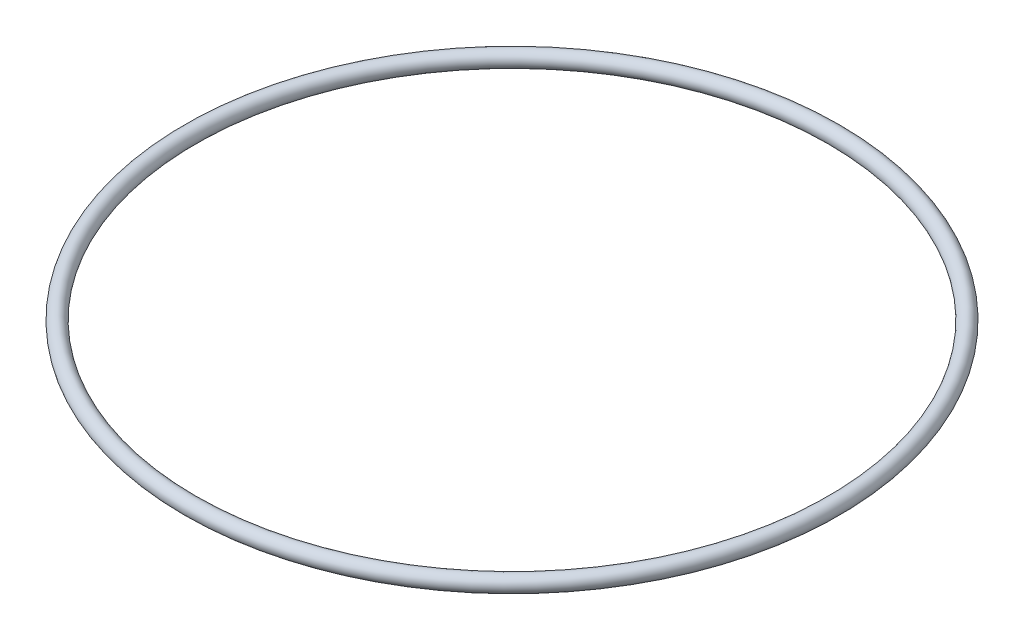
ISO-10303-21;
HEADER;
FILE_DESCRIPTION(('STEP AP214'),'2;1');
FILE_NAME('part.step','',(''),(''),'','','');
FILE_SCHEMA(('AUTOMOTIVE_DESIGN { 1 0 10303 214 1 1 1 1 }'));
ENDSEC;
DATA;
#1=APPLICATION_CONTEXT('core data for automotive mechanical design processes');
#2=APPLICATION_PROTOCOL_DEFINITION('international standard','automotive_design',2000,#1);
#3=PRODUCT_CONTEXT('',#1,'mechanical');
#4=PRODUCT('Part','Part','',(#3));
#5=PRODUCT_RELATED_PRODUCT_CATEGORY('part','',(#4));
#6=PRODUCT_DEFINITION_FORMATION('','',#4);
#7=PRODUCT_DEFINITION_CONTEXT('part definition',#1,'design');
#8=PRODUCT_DEFINITION('design','',#6,#7);
#9=PRODUCT_DEFINITION_SHAPE('','',#8);
#10=(LENGTH_UNIT() NAMED_UNIT(*) SI_UNIT(.MILLI.,.METRE.));
#11=(NAMED_UNIT(*) PLANE_ANGLE_UNIT() SI_UNIT($,.RADIAN.));
#12=(NAMED_UNIT(*) SI_UNIT($,.STERADIAN.) SOLID_ANGLE_UNIT());
#13=UNCERTAINTY_MEASURE_WITH_UNIT(LENGTH_MEASURE(1.E-05),#10,'distance_accuracy_value','');
#14=(GEOMETRIC_REPRESENTATION_CONTEXT(3) GLOBAL_UNCERTAINTY_ASSIGNED_CONTEXT((#13)) GLOBAL_UNIT_ASSIGNED_CONTEXT((#10,
#11,#12)) REPRESENTATION_CONTEXT('',''));
#15=CARTESIAN_POINT('',(0.,0.,0.));
#16=DIRECTION('',(0.,0.,1.));
#17=DIRECTION('',(1.,0.,0.));
#18=AXIS2_PLACEMENT_3D('',#15,#16,#17);
#19=CARTESIAN_POINT('',(0.,0.,0.));
#20=DIRECTION('',(0.,-1.,0.));
#21=DIRECTION('',(0.,0.,-1.));
#22=AXIS2_PLACEMENT_3D('',#19,#20,#21);
#23=TOROIDAL_SURFACE('',#22,61.5,1.5);
#24=CARTESIAN_POINT('',(0.,0.,-63.));
#25=VERTEX_POINT('',#24);
#26=VERTEX_LOOP('',#25);
#27=FACE_BOUND('',#26,.T.);
#28=ADVANCED_FACE('F28',(#27),#23,.T.);
#29=CLOSED_SHELL('',(#28));
#30=MANIFOLD_SOLID_BREP('B2',#29);
#31=ADVANCED_BREP_SHAPE_REPRESENTATION('',(#18,#30),#14);
#32=SHAPE_DEFINITION_REPRESENTATION(#9,#31);
ENDSEC;
END-ISO-10303-21;
